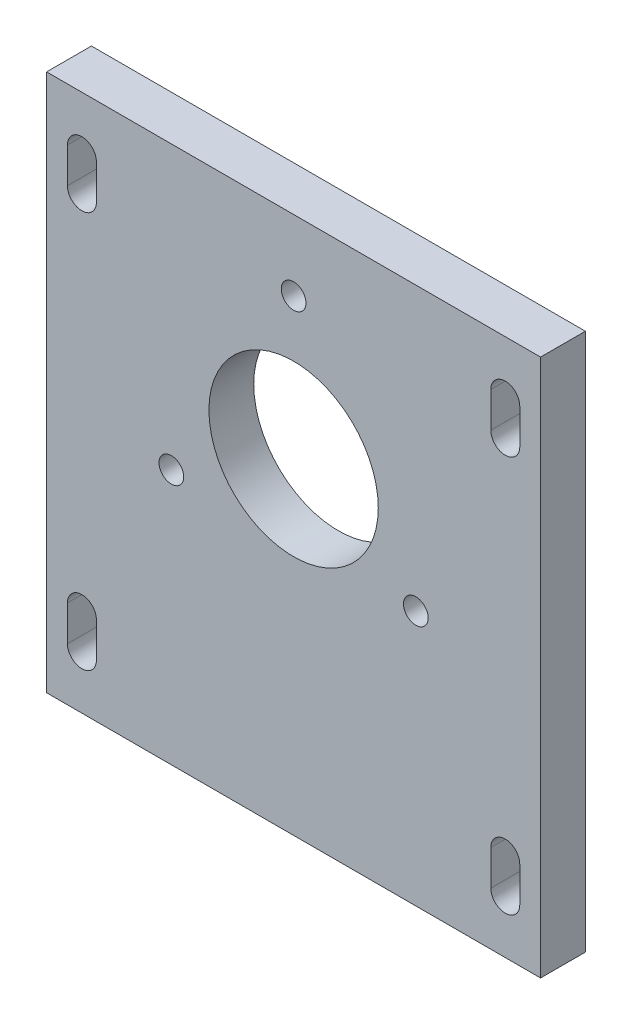
ISO-10303-21;
HEADER;
FILE_DESCRIPTION(('STEP AP214'),'2;1');
FILE_NAME('part.step','',(''),(''),'','','');
FILE_SCHEMA(('AUTOMOTIVE_DESIGN { 1 0 10303 214 1 1 1 1 }'));
ENDSEC;
DATA;
#1=APPLICATION_CONTEXT('core data for automotive mechanical design processes');
#2=APPLICATION_PROTOCOL_DEFINITION('international standard','automotive_design',2000,#1);
#3=PRODUCT_CONTEXT('',#1,'mechanical');
#4=PRODUCT('Part','Part','',(#3));
#5=PRODUCT_RELATED_PRODUCT_CATEGORY('part','',(#4));
#6=PRODUCT_DEFINITION_FORMATION('','',#4);
#7=PRODUCT_DEFINITION_CONTEXT('part definition',#1,'design');
#8=PRODUCT_DEFINITION('design','',#6,#7);
#9=PRODUCT_DEFINITION_SHAPE('','',#8);
#10=(LENGTH_UNIT() NAMED_UNIT(*) SI_UNIT(.MILLI.,.METRE.));
#11=(NAMED_UNIT(*) PLANE_ANGLE_UNIT() SI_UNIT($,.RADIAN.));
#12=(NAMED_UNIT(*) SI_UNIT($,.STERADIAN.) SOLID_ANGLE_UNIT());
#13=UNCERTAINTY_MEASURE_WITH_UNIT(LENGTH_MEASURE(1.E-05),#10,'distance_accuracy_value','');
#14=(GEOMETRIC_REPRESENTATION_CONTEXT(3) GLOBAL_UNCERTAINTY_ASSIGNED_CONTEXT((#13)) GLOBAL_UNIT_ASSIGNED_CONTEXT((#10,
#11,#12)) REPRESENTATION_CONTEXT('',''));
#15=CARTESIAN_POINT('',(0.,0.,0.));
#16=DIRECTION('',(0.,0.,1.));
#17=DIRECTION('',(1.,0.,0.));
#18=AXIS2_PLACEMENT_3D('',#15,#16,#17);
#19=CARTESIAN_POINT('',(0.,0.,6.35));
#20=DIRECTION('',(0.,0.,-1.));
#21=DIRECTION('',(-1.,0.,0.));
#22=AXIS2_PLACEMENT_3D('',#19,#20,#21);
#23=PLANE('',#22);
#24=CARTESIAN_POINT('',(-30.,-25.6,6.35));
#25=DIRECTION('',(0.,0.,1.));
#26=DIRECTION('',(-1.,0.,0.));
#27=AXIS2_PLACEMENT_3D('',#24,#25,#26);
#28=CIRCLE('',#27,2.05000000000001);
#29=CARTESIAN_POINT('',(-27.95,-25.6,6.35));
#30=VERTEX_POINT('',#29);
#31=CARTESIAN_POINT('',(-32.05,-25.6,6.35));
#32=VERTEX_POINT('',#31);
#33=EDGE_CURVE('E215',#30,#32,#28,.T.);
#34=ORIENTED_EDGE('',*,*,#33,.F.);
#35=DIRECTION('',(0.,1.,0.));
#36=VECTOR('',#35,1.);
#37=CARTESIAN_POINT('',(-27.95,-25.6,6.35));
#38=LINE('',#37,#36);
#39=CARTESIAN_POINT('',(-27.95,-30.6,6.35));
#40=VERTEX_POINT('',#39);
#41=EDGE_CURVE('E223',#40,#30,#38,.T.);
#42=ORIENTED_EDGE('',*,*,#41,.F.);
#43=CARTESIAN_POINT('',(-30.,-30.6,6.35));
#44=DIRECTION('',(0.,0.,1.));
#45=DIRECTION('',(-1.,0.,0.));
#46=AXIS2_PLACEMENT_3D('',#43,#44,#45);
#47=CIRCLE('',#46,2.05000000000001);
#48=CARTESIAN_POINT('',(-32.05,-30.6,6.35));
#49=VERTEX_POINT('',#48);
#50=EDGE_CURVE('E220',#49,#40,#47,.T.);
#51=ORIENTED_EDGE('',*,*,#50,.F.);
#52=DIRECTION('',(0.,-1.,0.));
#53=VECTOR('',#52,1.);
#54=CARTESIAN_POINT('',(-32.05,-25.6,6.35));
#55=LINE('',#54,#53);
#56=EDGE_CURVE('E217',#32,#49,#55,.T.);
#57=ORIENTED_EDGE('',*,*,#56,.F.);
#58=EDGE_LOOP('',(#34,#42,#51,#57));
#59=FACE_BOUND('',#58,.T.);
#60=CARTESIAN_POINT('',(-30.,25.6,6.35));
#61=DIRECTION('',(0.,0.,1.));
#62=DIRECTION('',(1.,0.,0.));
#63=AXIS2_PLACEMENT_3D('',#60,#61,#62);
#64=CIRCLE('',#63,2.05000000000001);
#65=CARTESIAN_POINT('',(-32.05,25.6,6.35));
#66=VERTEX_POINT('',#65);
#67=CARTESIAN_POINT('',(-27.95,25.6,6.35));
#68=VERTEX_POINT('',#67);
#69=EDGE_CURVE('E277',#66,#68,#64,.T.);
#70=ORIENTED_EDGE('',*,*,#69,.F.);
#71=DIRECTION('',(0.,-1.,0.));
#72=VECTOR('',#71,1.);
#73=CARTESIAN_POINT('',(-32.05,25.6,6.35));
#74=LINE('',#73,#72);
#75=CARTESIAN_POINT('',(-32.05,30.6,6.35));
#76=VERTEX_POINT('',#75);
#77=EDGE_CURVE('E285',#76,#66,#74,.T.);
#78=ORIENTED_EDGE('',*,*,#77,.F.);
#79=CARTESIAN_POINT('',(-30.,30.6,6.35));
#80=DIRECTION('',(0.,0.,1.));
#81=DIRECTION('',(1.,0.,0.));
#82=AXIS2_PLACEMENT_3D('',#79,#80,#81);
#83=CIRCLE('',#82,2.05000000000001);
#84=CARTESIAN_POINT('',(-27.95,30.6,6.35));
#85=VERTEX_POINT('',#84);
#86=EDGE_CURVE('E282',#85,#76,#83,.T.);
#87=ORIENTED_EDGE('',*,*,#86,.F.);
#88=DIRECTION('',(0.,1.,0.));
#89=VECTOR('',#88,1.);
#90=CARTESIAN_POINT('',(-27.95,25.6,6.35));
#91=LINE('',#90,#89);
#92=EDGE_CURVE('E279',#68,#85,#91,.T.);
#93=ORIENTED_EDGE('',*,*,#92,.F.);
#94=EDGE_LOOP('',(#70,#78,#87,#93));
#95=FACE_BOUND('',#94,.T.);
#96=DIRECTION('',(0.,1.,0.));
#97=VECTOR('',#96,1.);
#98=CARTESIAN_POINT('',(35.,-38.1,6.35));
#99=LINE('',#98,#97);
#100=CARTESIAN_POINT('',(35.,-38.1,6.35));
#101=VERTEX_POINT('',#100);
#102=CARTESIAN_POINT('',(35.,38.1,6.35));
#103=VERTEX_POINT('',#102);
#104=EDGE_CURVE('E308',#101,#103,#99,.T.);
#105=ORIENTED_EDGE('',*,*,#104,.T.);
#106=DIRECTION('',(-1.,0.,0.));
#107=VECTOR('',#106,1.);
#108=CARTESIAN_POINT('',(-35.,38.1,6.35));
#109=LINE('',#108,#107);
#110=CARTESIAN_POINT('',(-35.,38.1,6.35));
#111=VERTEX_POINT('',#110);
#112=EDGE_CURVE('E311',#103,#111,#109,.T.);
#113=ORIENTED_EDGE('',*,*,#112,.T.);
#114=DIRECTION('',(0.,-1.,0.));
#115=VECTOR('',#114,1.);
#116=CARTESIAN_POINT('',(-35.,-38.1,6.35));
#117=LINE('',#116,#115);
#118=CARTESIAN_POINT('',(-35.,-38.1,6.35));
#119=VERTEX_POINT('',#118);
#120=EDGE_CURVE('E314',#111,#119,#117,.T.);
#121=ORIENTED_EDGE('',*,*,#120,.T.);
#122=DIRECTION('',(1.,0.,0.));
#123=VECTOR('',#122,1.);
#124=CARTESIAN_POINT('',(-35.,-38.1,6.35));
#125=LINE('',#124,#123);
#126=EDGE_CURVE('E316',#119,#101,#125,.T.);
#127=ORIENTED_EDGE('',*,*,#126,.T.);
#128=EDGE_LOOP('',(#105,#113,#121,#127));
#129=FACE_BOUND('',#128,.T.);
#130=CARTESIAN_POINT('',(30.,25.6,6.35));
#131=DIRECTION('',(0.,0.,1.));
#132=DIRECTION('',(-1.,0.,0.));
#133=AXIS2_PLACEMENT_3D('',#130,#131,#132);
#134=CIRCLE('',#133,2.05000000000001);
#135=CARTESIAN_POINT('',(27.95,25.6,6.35));
#136=VERTEX_POINT('',#135);
#137=CARTESIAN_POINT('',(32.05,25.6,6.35));
#138=VERTEX_POINT('',#137);
#139=EDGE_CURVE('E246',#136,#138,#134,.T.);
#140=ORIENTED_EDGE('',*,*,#139,.F.);
#141=DIRECTION('',(0.,-1.,0.));
#142=VECTOR('',#141,1.);
#143=CARTESIAN_POINT('',(27.95,25.6,6.35));
#144=LINE('',#143,#142);
#145=CARTESIAN_POINT('',(27.95,30.6,6.35));
#146=VERTEX_POINT('',#145);
#147=EDGE_CURVE('E254',#146,#136,#144,.T.);
#148=ORIENTED_EDGE('',*,*,#147,.F.);
#149=CARTESIAN_POINT('',(30.,30.6,6.35));
#150=DIRECTION('',(0.,0.,1.));
#151=DIRECTION('',(-1.,0.,0.));
#152=AXIS2_PLACEMENT_3D('',#149,#150,#151);
#153=CIRCLE('',#152,2.05000000000001);
#154=CARTESIAN_POINT('',(32.05,30.6,6.35));
#155=VERTEX_POINT('',#154);
#156=EDGE_CURVE('E251',#155,#146,#153,.T.);
#157=ORIENTED_EDGE('',*,*,#156,.F.);
#158=DIRECTION('',(0.,1.,0.));
#159=VECTOR('',#158,1.);
#160=CARTESIAN_POINT('',(32.05,25.6,6.35));
#161=LINE('',#160,#159);
#162=EDGE_CURVE('E248',#138,#155,#161,.T.);
#163=ORIENTED_EDGE('',*,*,#162,.F.);
#164=EDGE_LOOP('',(#140,#148,#157,#163));
#165=FACE_BOUND('',#164,.T.);
#166=CARTESIAN_POINT('',(30.,-25.6,6.35));
#167=DIRECTION('',(0.,0.,1.));
#168=DIRECTION('',(1.,0.,0.));
#169=AXIS2_PLACEMENT_3D('',#166,#167,#168);
#170=CIRCLE('',#169,2.05000000000001);
#171=CARTESIAN_POINT('',(32.05,-25.6,6.35));
#172=VERTEX_POINT('',#171);
#173=CARTESIAN_POINT('',(27.95,-25.6,6.35));
#174=VERTEX_POINT('',#173);
#175=EDGE_CURVE('E176',#172,#174,#170,.T.);
#176=ORIENTED_EDGE('',*,*,#175,.F.);
#177=DIRECTION('',(0.,1.,0.));
#178=VECTOR('',#177,1.);
#179=CARTESIAN_POINT('',(32.05,-25.6,6.35));
#180=LINE('',#179,#178);
#181=CARTESIAN_POINT('',(32.05,-30.6,6.35));
#182=VERTEX_POINT('',#181);
#183=EDGE_CURVE('E199',#182,#172,#180,.T.);
#184=ORIENTED_EDGE('',*,*,#183,.F.);
#185=CARTESIAN_POINT('',(30.,-30.6,6.35));
#186=DIRECTION('',(0.,0.,1.));
#187=DIRECTION('',(1.,0.,0.));
#188=AXIS2_PLACEMENT_3D('',#185,#186,#187);
#189=CIRCLE('',#188,2.05000000000001);
#190=CARTESIAN_POINT('',(27.95,-30.6,6.35));
#191=VERTEX_POINT('',#190);
#192=EDGE_CURVE('E197',#191,#182,#189,.T.);
#193=ORIENTED_EDGE('',*,*,#192,.F.);
#194=DIRECTION('',(0.,-1.,0.));
#195=VECTOR('',#194,1.);
#196=CARTESIAN_POINT('',(27.95,-25.6,6.35));
#197=LINE('',#196,#195);
#198=EDGE_CURVE('E184',#174,#191,#197,.T.);
#199=ORIENTED_EDGE('',*,*,#198,.F.);
#200=EDGE_LOOP('',(#176,#184,#193,#199));
#201=FACE_BOUND('',#200,.T.);
#202=CARTESIAN_POINT('',(0.,28.1,6.35));
#203=DIRECTION('',(0.,0.,1.));
#204=DIRECTION('',(1.,0.,0.));
#205=AXIS2_PLACEMENT_3D('',#202,#203,#204);
#206=CIRCLE('',#205,1.75);
#207=CARTESIAN_POINT('',(1.75,28.1,6.35));
#208=VERTEX_POINT('',#207);
#209=EDGE_CURVE('E205',#208,#208,#206,.T.);
#210=ORIENTED_EDGE('',*,*,#209,.F.);
#211=EDGE_LOOP('',(#210));
#212=FACE_BOUND('',#211,.T.);
#213=CARTESIAN_POINT('',(0.,8.09999999999998,6.35));
#214=DIRECTION('',(0.,0.,1.));
#215=DIRECTION('',(1.,0.,0.));
#216=AXIS2_PLACEMENT_3D('',#213,#214,#215);
#217=CIRCLE('',#216,12.);
#218=CARTESIAN_POINT('',(12.,8.09999999999998,6.35));
#219=VERTEX_POINT('',#218);
#220=EDGE_CURVE('E482',#219,#219,#217,.T.);
#221=ORIENTED_EDGE('',*,*,#220,.F.);
#222=EDGE_LOOP('',(#221));
#223=FACE_BOUND('',#222,.T.);
#224=CARTESIAN_POINT('',(17.3205080756888,-1.90000000000003,6.35));
#225=DIRECTION('',(0.,0.,1.));
#226=DIRECTION('',(1.,0.,0.));
#227=AXIS2_PLACEMENT_3D('',#224,#225,#226);
#228=CIRCLE('',#227,1.74999999999871);
#229=CARTESIAN_POINT('',(19.0705080756875,-1.90000000000003,6.35));
#230=VERTEX_POINT('',#229);
#231=EDGE_CURVE('E476',#230,#230,#228,.T.);
#232=ORIENTED_EDGE('',*,*,#231,.F.);
#233=EDGE_LOOP('',(#232));
#234=FACE_BOUND('',#233,.T.);
#235=CARTESIAN_POINT('',(-17.3205080756888,-1.90000000000004,6.35));
#236=DIRECTION('',(0.,0.,1.));
#237=DIRECTION('',(1.,0.,0.));
#238=AXIS2_PLACEMENT_3D('',#235,#236,#237);
#239=CIRCLE('',#238,1.74999999999829);
#240=CARTESIAN_POINT('',(-15.5705080756905,-1.90000000000004,6.35));
#241=VERTEX_POINT('',#240);
#242=EDGE_CURVE('E467',#241,#241,#239,.T.);
#243=ORIENTED_EDGE('',*,*,#242,.F.);
#244=EDGE_LOOP('',(#243));
#245=FACE_BOUND('',#244,.T.);
#246=ADVANCED_FACE('F39',(#59,#95,#129,#165,#201,#212,#223,#234,#245),#23,.F.);
#247=CARTESIAN_POINT('',(0.,0.,0.));
#248=DIRECTION('',(0.,0.,-1.));
#249=DIRECTION('',(-1.,0.,0.));
#250=AXIS2_PLACEMENT_3D('',#247,#248,#249);
#251=PLANE('',#250);
#252=CARTESIAN_POINT('',(17.3205080756888,-1.90000000000003,0.));
#253=DIRECTION('',(0.,0.,1.));
#254=DIRECTION('',(1.,0.,0.));
#255=AXIS2_PLACEMENT_3D('',#252,#253,#254);
#256=CIRCLE('',#255,1.74999999999871);
#257=CARTESIAN_POINT('',(19.0705080756875,-1.90000000000003,0.));
#258=VERTEX_POINT('',#257);
#259=EDGE_CURVE('E473',#258,#258,#256,.T.);
#260=ORIENTED_EDGE('',*,*,#259,.T.);
#261=EDGE_LOOP('',(#260));
#262=FACE_BOUND('',#261,.T.);
#263=CARTESIAN_POINT('',(0.,28.1,0.));
#264=DIRECTION('',(0.,0.,1.));
#265=DIRECTION('',(1.,0.,0.));
#266=AXIS2_PLACEMENT_3D('',#263,#264,#265);
#267=CIRCLE('',#266,1.75);
#268=CARTESIAN_POINT('',(1.75,28.1,0.));
#269=VERTEX_POINT('',#268);
#270=EDGE_CURVE('E485',#269,#269,#267,.T.);
#271=ORIENTED_EDGE('',*,*,#270,.T.);
#272=EDGE_LOOP('',(#271));
#273=FACE_BOUND('',#272,.T.);
#274=DIRECTION('',(0.,1.,0.));
#275=VECTOR('',#274,1.);
#276=CARTESIAN_POINT('',(35.,-38.1,0.));
#277=LINE('',#276,#275);
#278=CARTESIAN_POINT('',(35.,-38.1,0.));
#279=VERTEX_POINT('',#278);
#280=CARTESIAN_POINT('',(35.,38.1,0.));
#281=VERTEX_POINT('',#280);
#282=EDGE_CURVE('E307',#279,#281,#277,.T.);
#283=ORIENTED_EDGE('',*,*,#282,.F.);
#284=DIRECTION('',(1.,0.,0.));
#285=VECTOR('',#284,1.);
#286=CARTESIAN_POINT('',(-35.,-38.1,0.));
#287=LINE('',#286,#285);
#288=CARTESIAN_POINT('',(-35.,-38.1,0.));
#289=VERTEX_POINT('',#288);
#290=EDGE_CURVE('E312',#289,#279,#287,.T.);
#291=ORIENTED_EDGE('',*,*,#290,.F.);
#292=DIRECTION('',(0.,-1.,0.));
#293=VECTOR('',#292,1.);
#294=CARTESIAN_POINT('',(-35.,-38.1,0.));
#295=LINE('',#294,#293);
#296=CARTESIAN_POINT('',(-35.,38.1,0.));
#297=VERTEX_POINT('',#296);
#298=EDGE_CURVE('E323',#297,#289,#295,.T.);
#299=ORIENTED_EDGE('',*,*,#298,.F.);
#300=DIRECTION('',(-1.,0.,0.));
#301=VECTOR('',#300,1.);
#302=CARTESIAN_POINT('',(-35.,38.1,0.));
#303=LINE('',#302,#301);
#304=EDGE_CURVE('E321',#281,#297,#303,.T.);
#305=ORIENTED_EDGE('',*,*,#304,.F.);
#306=EDGE_LOOP('',(#283,#291,#299,#305));
#307=FACE_BOUND('',#306,.T.);
#308=DIRECTION('',(0.,-1.,0.));
#309=VECTOR('',#308,1.);
#310=CARTESIAN_POINT('',(-32.05,25.6,0.));
#311=LINE('',#310,#309);
#312=CARTESIAN_POINT('',(-32.05,30.6,0.));
#313=VERTEX_POINT('',#312);
#314=CARTESIAN_POINT('',(-32.05,25.6,0.));
#315=VERTEX_POINT('',#314);
#316=EDGE_CURVE('E280',#313,#315,#311,.T.);
#317=ORIENTED_EDGE('',*,*,#316,.T.);
#318=CARTESIAN_POINT('',(-30.,25.6,0.));
#319=DIRECTION('',(0.,0.,1.));
#320=DIRECTION('',(1.,0.,0.));
#321=AXIS2_PLACEMENT_3D('',#318,#319,#320);
#322=CIRCLE('',#321,2.05000000000001);
#323=CARTESIAN_POINT('',(-27.95,25.6,0.));
#324=VERTEX_POINT('',#323);
#325=EDGE_CURVE('E276',#315,#324,#322,.T.);
#326=ORIENTED_EDGE('',*,*,#325,.T.);
#327=DIRECTION('',(0.,1.,0.));
#328=VECTOR('',#327,1.);
#329=CARTESIAN_POINT('',(-27.95,25.6,0.));
#330=LINE('',#329,#328);
#331=CARTESIAN_POINT('',(-27.95,30.6,0.));
#332=VERTEX_POINT('',#331);
#333=EDGE_CURVE('E290',#324,#332,#330,.T.);
#334=ORIENTED_EDGE('',*,*,#333,.T.);
#335=CARTESIAN_POINT('',(-30.,30.6,0.));
#336=DIRECTION('',(0.,0.,1.));
#337=DIRECTION('',(1.,0.,0.));
#338=AXIS2_PLACEMENT_3D('',#335,#336,#337);
#339=CIRCLE('',#338,2.05000000000001);
#340=EDGE_CURVE('E293',#332,#313,#339,.T.);
#341=ORIENTED_EDGE('',*,*,#340,.T.);
#342=EDGE_LOOP('',(#317,#326,#334,#341));
#343=FACE_BOUND('',#342,.T.);
#344=DIRECTION('',(0.,-1.,0.));
#345=VECTOR('',#344,1.);
#346=CARTESIAN_POINT('',(27.95,25.6,0.));
#347=LINE('',#346,#345);
#348=CARTESIAN_POINT('',(27.95,30.6,0.));
#349=VERTEX_POINT('',#348);
#350=CARTESIAN_POINT('',(27.95,25.6,0.));
#351=VERTEX_POINT('',#350);
#352=EDGE_CURVE('E249',#349,#351,#347,.T.);
#353=ORIENTED_EDGE('',*,*,#352,.T.);
#354=CARTESIAN_POINT('',(30.,25.6,0.));
#355=DIRECTION('',(0.,0.,1.));
#356=DIRECTION('',(-1.,0.,0.));
#357=AXIS2_PLACEMENT_3D('',#354,#355,#356);
#358=CIRCLE('',#357,2.05000000000001);
#359=CARTESIAN_POINT('',(32.05,25.6,0.));
#360=VERTEX_POINT('',#359);
#361=EDGE_CURVE('E245',#351,#360,#358,.T.);
#362=ORIENTED_EDGE('',*,*,#361,.T.);
#363=DIRECTION('',(0.,1.,0.));
#364=VECTOR('',#363,1.);
#365=CARTESIAN_POINT('',(32.05,25.6,0.));
#366=LINE('',#365,#364);
#367=CARTESIAN_POINT('',(32.05,30.6,0.));
#368=VERTEX_POINT('',#367);
#369=EDGE_CURVE('E259',#360,#368,#366,.T.);
#370=ORIENTED_EDGE('',*,*,#369,.T.);
#371=CARTESIAN_POINT('',(30.,30.6,0.));
#372=DIRECTION('',(0.,0.,1.));
#373=DIRECTION('',(-1.,0.,0.));
#374=AXIS2_PLACEMENT_3D('',#371,#372,#373);
#375=CIRCLE('',#374,2.05000000000001);
#376=EDGE_CURVE('E262',#368,#349,#375,.T.);
#377=ORIENTED_EDGE('',*,*,#376,.T.);
#378=EDGE_LOOP('',(#353,#362,#370,#377));
#379=FACE_BOUND('',#378,.T.);
#380=DIRECTION('',(0.,1.,0.));
#381=VECTOR('',#380,1.);
#382=CARTESIAN_POINT('',(-27.95,-25.6,0.));
#383=LINE('',#382,#381);
#384=CARTESIAN_POINT('',(-27.95,-30.6,0.));
#385=VERTEX_POINT('',#384);
#386=CARTESIAN_POINT('',(-27.95,-25.6,0.));
#387=VERTEX_POINT('',#386);
#388=EDGE_CURVE('E218',#385,#387,#383,.T.);
#389=ORIENTED_EDGE('',*,*,#388,.T.);
#390=CARTESIAN_POINT('',(-30.,-25.6,0.));
#391=DIRECTION('',(0.,0.,1.));
#392=DIRECTION('',(-1.,0.,0.));
#393=AXIS2_PLACEMENT_3D('',#390,#391,#392);
#394=CIRCLE('',#393,2.05000000000001);
#395=CARTESIAN_POINT('',(-32.05,-25.6,0.));
#396=VERTEX_POINT('',#395);
#397=EDGE_CURVE('E192',#387,#396,#394,.T.);
#398=ORIENTED_EDGE('',*,*,#397,.T.);
#399=DIRECTION('',(0.,-1.,0.));
#400=VECTOR('',#399,1.);
#401=CARTESIAN_POINT('',(-32.05,-25.6,0.));
#402=LINE('',#401,#400);
#403=CARTESIAN_POINT('',(-32.05,-30.6,0.));
#404=VERTEX_POINT('',#403);
#405=EDGE_CURVE('E228',#396,#404,#402,.T.);
#406=ORIENTED_EDGE('',*,*,#405,.T.);
#407=CARTESIAN_POINT('',(-30.,-30.6,0.));
#408=DIRECTION('',(0.,0.,1.));
#409=DIRECTION('',(-1.,0.,0.));
#410=AXIS2_PLACEMENT_3D('',#407,#408,#409);
#411=CIRCLE('',#410,2.05000000000001);
#412=EDGE_CURVE('E231',#404,#385,#411,.T.);
#413=ORIENTED_EDGE('',*,*,#412,.T.);
#414=EDGE_LOOP('',(#389,#398,#406,#413));
#415=FACE_BOUND('',#414,.T.);
#416=DIRECTION('',(0.,1.,0.));
#417=VECTOR('',#416,1.);
#418=CARTESIAN_POINT('',(32.05,-25.6,0.));
#419=LINE('',#418,#417);
#420=CARTESIAN_POINT('',(32.05,-30.6,0.));
#421=VERTEX_POINT('',#420);
#422=CARTESIAN_POINT('',(32.05,-25.6,0.));
#423=VERTEX_POINT('',#422);
#424=EDGE_CURVE('E185',#421,#423,#419,.T.);
#425=ORIENTED_EDGE('',*,*,#424,.T.);
#426=CARTESIAN_POINT('',(30.,-25.6,0.));
#427=DIRECTION('',(0.,0.,1.));
#428=DIRECTION('',(1.,0.,0.));
#429=AXIS2_PLACEMENT_3D('',#426,#427,#428);
#430=CIRCLE('',#429,2.05000000000001);
#431=CARTESIAN_POINT('',(27.95,-25.6,0.));
#432=VERTEX_POINT('',#431);
#433=EDGE_CURVE('E62',#423,#432,#430,.T.);
#434=ORIENTED_EDGE('',*,*,#433,.T.);
#435=DIRECTION('',(0.,-1.,0.));
#436=VECTOR('',#435,1.);
#437=CARTESIAN_POINT('',(27.95,-25.6,0.));
#438=LINE('',#437,#436);
#439=CARTESIAN_POINT('',(27.95,-30.6,0.));
#440=VERTEX_POINT('',#439);
#441=EDGE_CURVE('E191',#432,#440,#438,.T.);
#442=ORIENTED_EDGE('',*,*,#441,.T.);
#443=CARTESIAN_POINT('',(30.,-30.6,0.));
#444=DIRECTION('',(0.,0.,1.));
#445=DIRECTION('',(1.,0.,0.));
#446=AXIS2_PLACEMENT_3D('',#443,#444,#445);
#447=CIRCLE('',#446,2.05000000000001);
#448=EDGE_CURVE('E207',#440,#421,#447,.T.);
#449=ORIENTED_EDGE('',*,*,#448,.T.);
#450=EDGE_LOOP('',(#425,#434,#442,#449));
#451=FACE_BOUND('',#450,.T.);
#452=CARTESIAN_POINT('',(0.,8.09999999999998,0.));
#453=DIRECTION('',(0.,0.,1.));
#454=DIRECTION('',(1.,0.,0.));
#455=AXIS2_PLACEMENT_3D('',#452,#453,#454);
#456=CIRCLE('',#455,12.);
#457=CARTESIAN_POINT('',(12.,8.09999999999998,0.));
#458=VERTEX_POINT('',#457);
#459=EDGE_CURVE('E479',#458,#458,#456,.T.);
#460=ORIENTED_EDGE('',*,*,#459,.T.);
#461=EDGE_LOOP('',(#460));
#462=FACE_BOUND('',#461,.T.);
#463=CARTESIAN_POINT('',(-17.3205080756888,-1.90000000000004,0.));
#464=DIRECTION('',(0.,0.,1.));
#465=DIRECTION('',(1.,0.,0.));
#466=AXIS2_PLACEMENT_3D('',#463,#464,#465);
#467=CIRCLE('',#466,1.74999999999829);
#468=CARTESIAN_POINT('',(-15.5705080756905,-1.90000000000004,0.));
#469=VERTEX_POINT('',#468);
#470=EDGE_CURVE('E470',#469,#469,#467,.T.);
#471=ORIENTED_EDGE('',*,*,#470,.T.);
#472=EDGE_LOOP('',(#471));
#473=FACE_BOUND('',#472,.T.);
#474=ADVANCED_FACE('F341',(#262,#273,#307,#343,#379,#415,#451,#462,#473),#251,.T.);
#475=CARTESIAN_POINT('',(35.,-38.1,6.35));
#476=DIRECTION('',(-1.,0.,0.));
#477=DIRECTION('',(0.,0.,1.));
#478=AXIS2_PLACEMENT_3D('',#475,#476,#477);
#479=PLANE('',#478);
#480=ORIENTED_EDGE('',*,*,#282,.T.);
#481=DIRECTION('',(0.,0.,-1.));
#482=VECTOR('',#481,1.);
#483=CARTESIAN_POINT('',(35.,38.1,6.35));
#484=LINE('',#483,#482);
#485=EDGE_CURVE('E11',#103,#281,#484,.T.);
#486=ORIENTED_EDGE('',*,*,#485,.F.);
#487=ORIENTED_EDGE('',*,*,#104,.F.);
#488=DIRECTION('',(0.,0.,-1.));
#489=VECTOR('',#488,1.);
#490=CARTESIAN_POINT('',(35.,-38.1,6.35));
#491=LINE('',#490,#489);
#492=EDGE_CURVE('E318',#101,#279,#491,.T.);
#493=ORIENTED_EDGE('',*,*,#492,.T.);
#494=EDGE_LOOP('',(#480,#486,#487,#493));
#495=FACE_BOUND('',#494,.T.);
#496=ADVANCED_FACE('F41',(#495),#479,.F.);
#497=CARTESIAN_POINT('',(-35.,38.1,6.35));
#498=DIRECTION('',(0.,-1.,0.));
#499=DIRECTION('',(0.,0.,-1.));
#500=AXIS2_PLACEMENT_3D('',#497,#498,#499);
#501=PLANE('',#500);
#502=ORIENTED_EDGE('',*,*,#304,.T.);
#503=DIRECTION('',(0.,0.,-1.));
#504=VECTOR('',#503,1.);
#505=CARTESIAN_POINT('',(-35.,38.1,6.35));
#506=LINE('',#505,#504);
#507=EDGE_CURVE('E47',#111,#297,#506,.T.);
#508=ORIENTED_EDGE('',*,*,#507,.F.);
#509=ORIENTED_EDGE('',*,*,#112,.F.);
#510=ORIENTED_EDGE('',*,*,#485,.T.);
#511=EDGE_LOOP('',(#502,#508,#509,#510));
#512=FACE_BOUND('',#511,.T.);
#513=ADVANCED_FACE('F352',(#512),#501,.F.);
#514=CARTESIAN_POINT('',(-35.,-38.1,6.35));
#515=DIRECTION('',(1.,0.,0.));
#516=DIRECTION('',(0.,0.,-1.));
#517=AXIS2_PLACEMENT_3D('',#514,#515,#516);
#518=PLANE('',#517);
#519=ORIENTED_EDGE('',*,*,#298,.T.);
#520=DIRECTION('',(0.,0.,-1.));
#521=VECTOR('',#520,1.);
#522=CARTESIAN_POINT('',(-35.,-38.1,6.35));
#523=LINE('',#522,#521);
#524=EDGE_CURVE('E328',#119,#289,#523,.T.);
#525=ORIENTED_EDGE('',*,*,#524,.F.);
#526=ORIENTED_EDGE('',*,*,#120,.F.);
#527=ORIENTED_EDGE('',*,*,#507,.T.);
#528=EDGE_LOOP('',(#519,#525,#526,#527));
#529=FACE_BOUND('',#528,.T.);
#530=ADVANCED_FACE('F335',(#529),#518,.F.);
#531=CARTESIAN_POINT('',(-35.,-38.1,6.35));
#532=DIRECTION('',(0.,1.,0.));
#533=DIRECTION('',(0.,0.,1.));
#534=AXIS2_PLACEMENT_3D('',#531,#532,#533);
#535=PLANE('',#534);
#536=ORIENTED_EDGE('',*,*,#290,.T.);
#537=ORIENTED_EDGE('',*,*,#492,.F.);
#538=ORIENTED_EDGE('',*,*,#126,.F.);
#539=ORIENTED_EDGE('',*,*,#524,.T.);
#540=EDGE_LOOP('',(#536,#537,#538,#539));
#541=FACE_BOUND('',#540,.T.);
#542=ADVANCED_FACE('F345',(#541),#535,.F.);
#543=CARTESIAN_POINT('',(-30.,25.6,6.35));
#544=DIRECTION('',(0.,0.,-1.));
#545=DIRECTION('',(-1.,0.,0.));
#546=AXIS2_PLACEMENT_3D('',#543,#544,#545);
#547=CYLINDRICAL_SURFACE('',#546,2.05000000000001);
#548=ORIENTED_EDGE('',*,*,#325,.F.);
#549=DIRECTION('',(0.,0.,-1.));
#550=VECTOR('',#549,1.);
#551=CARTESIAN_POINT('',(-32.05,25.6,6.35));
#552=LINE('',#551,#550);
#553=EDGE_CURVE('E287',#66,#315,#552,.T.);
#554=ORIENTED_EDGE('',*,*,#553,.F.);
#555=ORIENTED_EDGE('',*,*,#69,.T.);
#556=DIRECTION('',(0.,0.,-1.));
#557=VECTOR('',#556,1.);
#558=CARTESIAN_POINT('',(-27.95,25.6,6.35));
#559=LINE('',#558,#557);
#560=EDGE_CURVE('E304',#68,#324,#559,.T.);
#561=ORIENTED_EDGE('',*,*,#560,.T.);
#562=EDGE_LOOP('',(#548,#554,#555,#561));
#563=FACE_BOUND('',#562,.T.);
#564=ADVANCED_FACE('F370',(#563),#547,.F.);
#565=CARTESIAN_POINT('',(-27.95,25.6,6.35));
#566=DIRECTION('',(-1.,0.,0.));
#567=DIRECTION('',(0.,0.,1.));
#568=AXIS2_PLACEMENT_3D('',#565,#566,#567);
#569=PLANE('',#568);
#570=ORIENTED_EDGE('',*,*,#333,.F.);
#571=ORIENTED_EDGE('',*,*,#560,.F.);
#572=ORIENTED_EDGE('',*,*,#92,.T.);
#573=DIRECTION('',(0.,0.,-1.));
#574=VECTOR('',#573,1.);
#575=CARTESIAN_POINT('',(-27.95,30.6,6.35));
#576=LINE('',#575,#574);
#577=EDGE_CURVE('E302',#85,#332,#576,.T.);
#578=ORIENTED_EDGE('',*,*,#577,.T.);
#579=EDGE_LOOP('',(#570,#571,#572,#578));
#580=FACE_BOUND('',#579,.T.);
#581=ADVANCED_FACE('F377',(#580),#569,.T.);
#582=CARTESIAN_POINT('',(-30.,30.6,6.35));
#583=DIRECTION('',(0.,0.,-1.));
#584=DIRECTION('',(-1.,0.,0.));
#585=AXIS2_PLACEMENT_3D('',#582,#583,#584);
#586=CYLINDRICAL_SURFACE('',#585,2.05000000000001);
#587=ORIENTED_EDGE('',*,*,#340,.F.);
#588=ORIENTED_EDGE('',*,*,#577,.F.);
#589=ORIENTED_EDGE('',*,*,#86,.T.);
#590=DIRECTION('',(0.,0.,-1.));
#591=VECTOR('',#590,1.);
#592=CARTESIAN_POINT('',(-32.05,30.6,6.35));
#593=LINE('',#592,#591);
#594=EDGE_CURVE('E300',#76,#313,#593,.T.);
#595=ORIENTED_EDGE('',*,*,#594,.T.);
#596=EDGE_LOOP('',(#587,#588,#589,#595));
#597=FACE_BOUND('',#596,.T.);
#598=ADVANCED_FACE('F382',(#597),#586,.F.);
#599=CARTESIAN_POINT('',(-32.05,25.6,6.35));
#600=DIRECTION('',(1.,0.,0.));
#601=DIRECTION('',(0.,0.,-1.));
#602=AXIS2_PLACEMENT_3D('',#599,#600,#601);
#603=PLANE('',#602);
#604=ORIENTED_EDGE('',*,*,#316,.F.);
#605=ORIENTED_EDGE('',*,*,#594,.F.);
#606=ORIENTED_EDGE('',*,*,#77,.T.);
#607=ORIENTED_EDGE('',*,*,#553,.T.);
#608=EDGE_LOOP('',(#604,#605,#606,#607));
#609=FACE_BOUND('',#608,.T.);
#610=ADVANCED_FACE('F389',(#609),#603,.T.);
#611=CARTESIAN_POINT('',(30.,25.6,6.35));
#612=DIRECTION('',(0.,0.,-1.));
#613=DIRECTION('',(-1.,0.,0.));
#614=AXIS2_PLACEMENT_3D('',#611,#612,#613);
#615=CYLINDRICAL_SURFACE('',#614,2.05000000000001);
#616=ORIENTED_EDGE('',*,*,#361,.F.);
#617=DIRECTION('',(0.,0.,-1.));
#618=VECTOR('',#617,1.);
#619=CARTESIAN_POINT('',(27.95,25.6,6.35));
#620=LINE('',#619,#618);
#621=EDGE_CURVE('E256',#136,#351,#620,.T.);
#622=ORIENTED_EDGE('',*,*,#621,.F.);
#623=ORIENTED_EDGE('',*,*,#139,.T.);
#624=DIRECTION('',(0.,0.,-1.));
#625=VECTOR('',#624,1.);
#626=CARTESIAN_POINT('',(32.05,25.6,6.35));
#627=LINE('',#626,#625);
#628=EDGE_CURVE('E273',#138,#360,#627,.T.);
#629=ORIENTED_EDGE('',*,*,#628,.T.);
#630=EDGE_LOOP('',(#616,#622,#623,#629));
#631=FACE_BOUND('',#630,.T.);
#632=ADVANCED_FACE('F402',(#631),#615,.F.);
#633=CARTESIAN_POINT('',(32.05,25.6,6.35));
#634=DIRECTION('',(-1.,0.,0.));
#635=DIRECTION('',(0.,0.,1.));
#636=AXIS2_PLACEMENT_3D('',#633,#634,#635);
#637=PLANE('',#636);
#638=ORIENTED_EDGE('',*,*,#369,.F.);
#639=ORIENTED_EDGE('',*,*,#628,.F.);
#640=ORIENTED_EDGE('',*,*,#162,.T.);
#641=DIRECTION('',(0.,0.,-1.));
#642=VECTOR('',#641,1.);
#643=CARTESIAN_POINT('',(32.05,30.6,6.35));
#644=LINE('',#643,#642);
#645=EDGE_CURVE('E271',#155,#368,#644,.T.);
#646=ORIENTED_EDGE('',*,*,#645,.T.);
#647=EDGE_LOOP('',(#638,#639,#640,#646));
#648=FACE_BOUND('',#647,.T.);
#649=ADVANCED_FACE('F407',(#648),#637,.T.);
#650=CARTESIAN_POINT('',(30.,30.6,6.35));
#651=DIRECTION('',(0.,0.,-1.));
#652=DIRECTION('',(-1.,0.,0.));
#653=AXIS2_PLACEMENT_3D('',#650,#651,#652);
#654=CYLINDRICAL_SURFACE('',#653,2.05000000000001);
#655=ORIENTED_EDGE('',*,*,#376,.F.);
#656=ORIENTED_EDGE('',*,*,#645,.F.);
#657=ORIENTED_EDGE('',*,*,#156,.T.);
#658=DIRECTION('',(0.,0.,-1.));
#659=VECTOR('',#658,1.);
#660=CARTESIAN_POINT('',(27.95,30.6,6.35));
#661=LINE('',#660,#659);
#662=EDGE_CURVE('E269',#146,#349,#661,.T.);
#663=ORIENTED_EDGE('',*,*,#662,.T.);
#664=EDGE_LOOP('',(#655,#656,#657,#663));
#665=FACE_BOUND('',#664,.T.);
#666=ADVANCED_FACE('F411',(#665),#654,.F.);
#667=CARTESIAN_POINT('',(27.95,25.6,6.35));
#668=DIRECTION('',(1.,0.,0.));
#669=DIRECTION('',(0.,0.,-1.));
#670=AXIS2_PLACEMENT_3D('',#667,#668,#669);
#671=PLANE('',#670);
#672=ORIENTED_EDGE('',*,*,#352,.F.);
#673=ORIENTED_EDGE('',*,*,#662,.F.);
#674=ORIENTED_EDGE('',*,*,#147,.T.);
#675=ORIENTED_EDGE('',*,*,#621,.T.);
#676=EDGE_LOOP('',(#672,#673,#674,#675));
#677=FACE_BOUND('',#676,.T.);
#678=ADVANCED_FACE('F415',(#677),#671,.T.);
#679=CARTESIAN_POINT('',(-30.,-25.6,6.35));
#680=DIRECTION('',(0.,0.,-1.));
#681=DIRECTION('',(-1.,0.,0.));
#682=AXIS2_PLACEMENT_3D('',#679,#680,#681);
#683=CYLINDRICAL_SURFACE('',#682,2.05000000000001);
#684=ORIENTED_EDGE('',*,*,#397,.F.);
#685=DIRECTION('',(0.,0.,-1.));
#686=VECTOR('',#685,1.);
#687=CARTESIAN_POINT('',(-27.95,-25.6,6.35));
#688=LINE('',#687,#686);
#689=EDGE_CURVE('E225',#30,#387,#688,.T.);
#690=ORIENTED_EDGE('',*,*,#689,.F.);
#691=ORIENTED_EDGE('',*,*,#33,.T.);
#692=DIRECTION('',(0.,0.,-1.));
#693=VECTOR('',#692,1.);
#694=CARTESIAN_POINT('',(-32.05,-25.6,6.35));
#695=LINE('',#694,#693);
#696=EDGE_CURVE('E242',#32,#396,#695,.T.);
#697=ORIENTED_EDGE('',*,*,#696,.T.);
#698=EDGE_LOOP('',(#684,#690,#691,#697));
#699=FACE_BOUND('',#698,.T.);
#700=ADVANCED_FACE('F419',(#699),#683,.F.);
#701=CARTESIAN_POINT('',(-32.05,-25.6,6.35));
#702=DIRECTION('',(1.,0.,0.));
#703=DIRECTION('',(0.,0.,-1.));
#704=AXIS2_PLACEMENT_3D('',#701,#702,#703);
#705=PLANE('',#704);
#706=ORIENTED_EDGE('',*,*,#405,.F.);
#707=ORIENTED_EDGE('',*,*,#696,.F.);
#708=ORIENTED_EDGE('',*,*,#56,.T.);
#709=DIRECTION('',(0.,0.,-1.));
#710=VECTOR('',#709,1.);
#711=CARTESIAN_POINT('',(-32.05,-30.6,6.35));
#712=LINE('',#711,#710);
#713=EDGE_CURVE('E240',#49,#404,#712,.T.);
#714=ORIENTED_EDGE('',*,*,#713,.T.);
#715=EDGE_LOOP('',(#706,#707,#708,#714));
#716=FACE_BOUND('',#715,.T.);
#717=ADVANCED_FACE('F423',(#716),#705,.T.);
#718=CARTESIAN_POINT('',(-30.,-30.6,6.35));
#719=DIRECTION('',(0.,0.,-1.));
#720=DIRECTION('',(-1.,0.,0.));
#721=AXIS2_PLACEMENT_3D('',#718,#719,#720);
#722=CYLINDRICAL_SURFACE('',#721,2.05000000000001);
#723=ORIENTED_EDGE('',*,*,#412,.F.);
#724=ORIENTED_EDGE('',*,*,#713,.F.);
#725=ORIENTED_EDGE('',*,*,#50,.T.);
#726=DIRECTION('',(0.,0.,-1.));
#727=VECTOR('',#726,1.);
#728=CARTESIAN_POINT('',(-27.95,-30.6,6.35));
#729=LINE('',#728,#727);
#730=EDGE_CURVE('E238',#40,#385,#729,.T.);
#731=ORIENTED_EDGE('',*,*,#730,.T.);
#732=EDGE_LOOP('',(#723,#724,#725,#731));
#733=FACE_BOUND('',#732,.T.);
#734=ADVANCED_FACE('F427',(#733),#722,.F.);
#735=CARTESIAN_POINT('',(-27.95,-25.6,6.35));
#736=DIRECTION('',(-1.,0.,0.));
#737=DIRECTION('',(0.,0.,1.));
#738=AXIS2_PLACEMENT_3D('',#735,#736,#737);
#739=PLANE('',#738);
#740=ORIENTED_EDGE('',*,*,#388,.F.);
#741=ORIENTED_EDGE('',*,*,#730,.F.);
#742=ORIENTED_EDGE('',*,*,#41,.T.);
#743=ORIENTED_EDGE('',*,*,#689,.T.);
#744=EDGE_LOOP('',(#740,#741,#742,#743));
#745=FACE_BOUND('',#744,.T.);
#746=ADVANCED_FACE('F431',(#745),#739,.T.);
#747=CARTESIAN_POINT('',(30.,-25.6,6.35));
#748=DIRECTION('',(0.,0.,-1.));
#749=DIRECTION('',(-1.,0.,0.));
#750=AXIS2_PLACEMENT_3D('',#747,#748,#749);
#751=CYLINDRICAL_SURFACE('',#750,2.05000000000001);
#752=ORIENTED_EDGE('',*,*,#433,.F.);
#753=DIRECTION('',(0.,0.,-1.));
#754=VECTOR('',#753,1.);
#755=CARTESIAN_POINT('',(32.05,-25.6,6.35));
#756=LINE('',#755,#754);
#757=EDGE_CURVE('E180',#172,#423,#756,.T.);
#758=ORIENTED_EDGE('',*,*,#757,.F.);
#759=ORIENTED_EDGE('',*,*,#175,.T.);
#760=DIRECTION('',(0.,0.,-1.));
#761=VECTOR('',#760,1.);
#762=CARTESIAN_POINT('',(27.95,-25.6,6.35));
#763=LINE('',#762,#761);
#764=EDGE_CURVE('E179',#174,#432,#763,.T.);
#765=ORIENTED_EDGE('',*,*,#764,.T.);
#766=EDGE_LOOP('',(#752,#758,#759,#765));
#767=FACE_BOUND('',#766,.T.);
#768=ADVANCED_FACE('F178',(#767),#751,.F.);
#769=CARTESIAN_POINT('',(27.95,-25.6,6.35));
#770=DIRECTION('',(1.,0.,0.));
#771=DIRECTION('',(0.,0.,-1.));
#772=AXIS2_PLACEMENT_3D('',#769,#770,#771);
#773=PLANE('',#772);
#774=ORIENTED_EDGE('',*,*,#441,.F.);
#775=ORIENTED_EDGE('',*,*,#764,.F.);
#776=ORIENTED_EDGE('',*,*,#198,.T.);
#777=DIRECTION('',(0.,0.,-1.));
#778=VECTOR('',#777,1.);
#779=CARTESIAN_POINT('',(27.95,-30.6,6.35));
#780=LINE('',#779,#778);
#781=EDGE_CURVE('E193',#191,#440,#780,.T.);
#782=ORIENTED_EDGE('',*,*,#781,.T.);
#783=EDGE_LOOP('',(#774,#775,#776,#782));
#784=FACE_BOUND('',#783,.T.);
#785=ADVANCED_FACE('F188',(#784),#773,.T.);
#786=CARTESIAN_POINT('',(30.,-30.6,6.35));
#787=DIRECTION('',(0.,0.,-1.));
#788=DIRECTION('',(-1.,0.,0.));
#789=AXIS2_PLACEMENT_3D('',#786,#787,#788);
#790=CYLINDRICAL_SURFACE('',#789,2.05000000000001);
#791=ORIENTED_EDGE('',*,*,#448,.F.);
#792=ORIENTED_EDGE('',*,*,#781,.F.);
#793=ORIENTED_EDGE('',*,*,#192,.T.);
#794=DIRECTION('',(0.,0.,-1.));
#795=VECTOR('',#794,1.);
#796=CARTESIAN_POINT('',(32.05,-30.6,6.35));
#797=LINE('',#796,#795);
#798=EDGE_CURVE('E54',#182,#421,#797,.T.);
#799=ORIENTED_EDGE('',*,*,#798,.T.);
#800=EDGE_LOOP('',(#791,#792,#793,#799));
#801=FACE_BOUND('',#800,.T.);
#802=ADVANCED_FACE('F440',(#801),#790,.F.);
#803=CARTESIAN_POINT('',(32.05,-25.6,6.35));
#804=DIRECTION('',(-1.,0.,0.));
#805=DIRECTION('',(0.,0.,1.));
#806=AXIS2_PLACEMENT_3D('',#803,#804,#805);
#807=PLANE('',#806);
#808=ORIENTED_EDGE('',*,*,#424,.F.);
#809=ORIENTED_EDGE('',*,*,#798,.F.);
#810=ORIENTED_EDGE('',*,*,#183,.T.);
#811=ORIENTED_EDGE('',*,*,#757,.T.);
#812=EDGE_LOOP('',(#808,#809,#810,#811));
#813=FACE_BOUND('',#812,.T.);
#814=ADVANCED_FACE('F443',(#813),#807,.T.);
#815=CARTESIAN_POINT('',(0.,28.1,6.35));
#816=DIRECTION('',(0.,0.,-1.));
#817=DIRECTION('',(-1.,0.,0.));
#818=AXIS2_PLACEMENT_3D('',#815,#816,#817);
#819=CYLINDRICAL_SURFACE('',#818,1.75);
#820=ORIENTED_EDGE('',*,*,#209,.T.);
#821=EDGE_LOOP('',(#820));
#822=FACE_BOUND('',#821,.T.);
#823=ORIENTED_EDGE('',*,*,#270,.F.);
#824=EDGE_LOOP('',(#823));
#825=FACE_BOUND('',#824,.T.);
#826=ADVANCED_FACE('F447',(#822,#825),#819,.F.);
#827=CARTESIAN_POINT('',(0.,8.09999999999998,6.35));
#828=DIRECTION('',(0.,0.,-1.));
#829=DIRECTION('',(-1.,0.,0.));
#830=AXIS2_PLACEMENT_3D('',#827,#828,#829);
#831=CYLINDRICAL_SURFACE('',#830,12.);
#832=ORIENTED_EDGE('',*,*,#220,.T.);
#833=EDGE_LOOP('',(#832));
#834=FACE_BOUND('',#833,.T.);
#835=ORIENTED_EDGE('',*,*,#459,.F.);
#836=EDGE_LOOP('',(#835));
#837=FACE_BOUND('',#836,.T.);
#838=ADVANCED_FACE('F450',(#834,#837),#831,.F.);
#839=CARTESIAN_POINT('',(17.3205080756888,-1.90000000000003,6.35));
#840=DIRECTION('',(0.,0.,-1.));
#841=DIRECTION('',(-1.,0.,0.));
#842=AXIS2_PLACEMENT_3D('',#839,#840,#841);
#843=CYLINDRICAL_SURFACE('',#842,1.74999999999871);
#844=ORIENTED_EDGE('',*,*,#231,.T.);
#845=EDGE_LOOP('',(#844));
#846=FACE_BOUND('',#845,.T.);
#847=ORIENTED_EDGE('',*,*,#259,.F.);
#848=EDGE_LOOP('',(#847));
#849=FACE_BOUND('',#848,.T.);
#850=ADVANCED_FACE('F454',(#846,#849),#843,.F.);
#851=CARTESIAN_POINT('',(-17.3205080756888,-1.90000000000004,6.35));
#852=DIRECTION('',(0.,0.,-1.));
#853=DIRECTION('',(-1.,0.,0.));
#854=AXIS2_PLACEMENT_3D('',#851,#852,#853);
#855=CYLINDRICAL_SURFACE('',#854,1.74999999999829);
#856=ORIENTED_EDGE('',*,*,#242,.T.);
#857=EDGE_LOOP('',(#856));
#858=FACE_BOUND('',#857,.T.);
#859=ORIENTED_EDGE('',*,*,#470,.F.);
#860=EDGE_LOOP('',(#859));
#861=FACE_BOUND('',#860,.T.);
#862=ADVANCED_FACE('F458',(#858,#861),#855,.F.);
#863=CLOSED_SHELL('',(#246,#474,#496,#513,#530,#542,#564,#581,#598,#610,#632,#649,#666,#678,
#700,#717,#734,#746,#768,#785,#802,#814,#826,#838,#850,#862));
#864=MANIFOLD_SOLID_BREP('B2',#863);
#865=ADVANCED_BREP_SHAPE_REPRESENTATION('',(#18,#864),#14);
#866=SHAPE_DEFINITION_REPRESENTATION(#9,#865);
ENDSEC;
END-ISO-10303-21;
